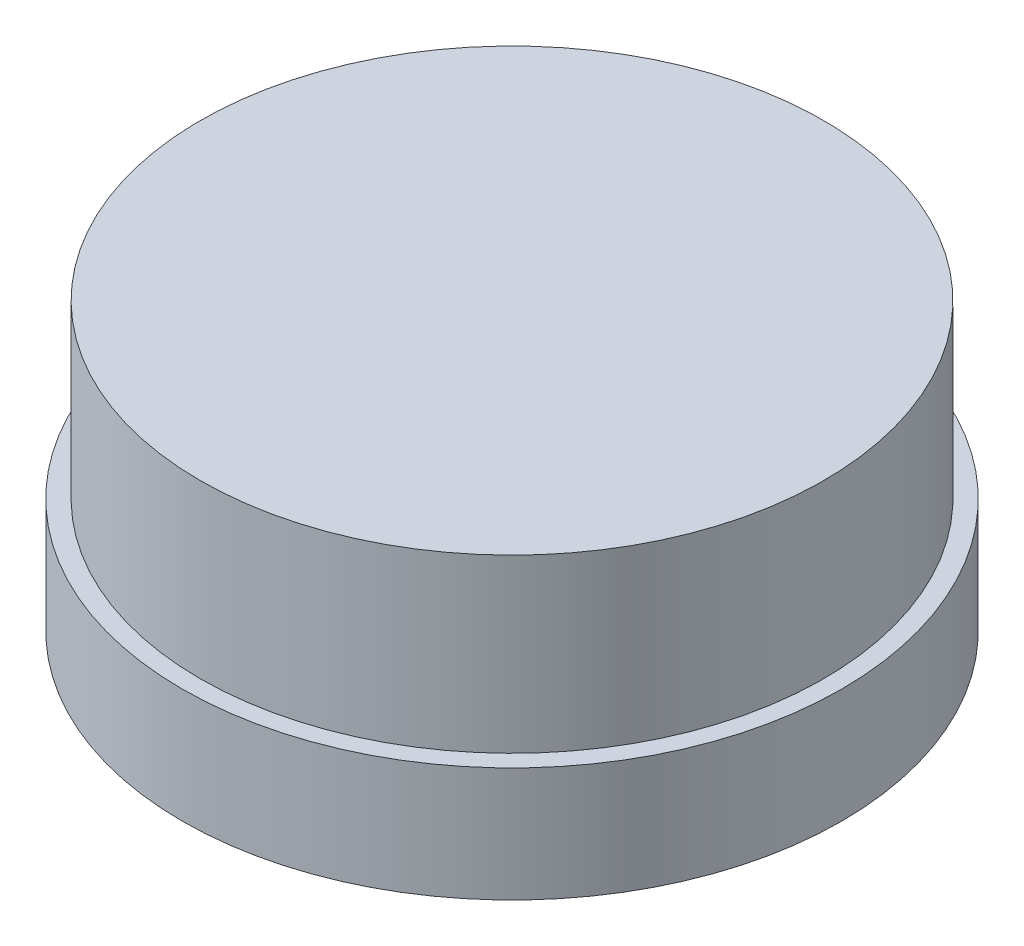
ISO-10303-21;
HEADER;
FILE_DESCRIPTION(('STEP AP214'),'2;1');
FILE_NAME('part.step','',(''),(''),'','','');
FILE_SCHEMA(('AUTOMOTIVE_DESIGN { 1 0 10303 214 1 1 1 1 }'));
ENDSEC;
DATA;
#1=APPLICATION_CONTEXT('core data for automotive mechanical design processes');
#2=APPLICATION_PROTOCOL_DEFINITION('international standard','automotive_design',2000,#1);
#3=PRODUCT_CONTEXT('',#1,'mechanical');
#4=PRODUCT('Part','Part','',(#3));
#5=PRODUCT_RELATED_PRODUCT_CATEGORY('part','',(#4));
#6=PRODUCT_DEFINITION_FORMATION('','',#4);
#7=PRODUCT_DEFINITION_CONTEXT('part definition',#1,'design');
#8=PRODUCT_DEFINITION('design','',#6,#7);
#9=PRODUCT_DEFINITION_SHAPE('','',#8);
#10=(LENGTH_UNIT() NAMED_UNIT(*) SI_UNIT(.MILLI.,.METRE.));
#11=(NAMED_UNIT(*) PLANE_ANGLE_UNIT() SI_UNIT($,.RADIAN.));
#12=(NAMED_UNIT(*) SI_UNIT($,.STERADIAN.) SOLID_ANGLE_UNIT());
#13=UNCERTAINTY_MEASURE_WITH_UNIT(LENGTH_MEASURE(1.E-05),#10,'distance_accuracy_value','');
#14=(GEOMETRIC_REPRESENTATION_CONTEXT(3) GLOBAL_UNCERTAINTY_ASSIGNED_CONTEXT((#13)) GLOBAL_UNIT_ASSIGNED_CONTEXT((#10,
#11,#12)) REPRESENTATION_CONTEXT('',''));
#15=CARTESIAN_POINT('',(0.,0.,0.));
#16=DIRECTION('',(0.,0.,1.));
#17=DIRECTION('',(1.,0.,0.));
#18=AXIS2_PLACEMENT_3D('',#15,#16,#17);
#19=CARTESIAN_POINT('',(0.,9.,0.));
#20=DIRECTION('',(0.,-1.,0.));
#21=DIRECTION('',(0.,0.,-1.));
#22=AXIS2_PLACEMENT_3D('',#19,#20,#21);
#23=CYLINDRICAL_SURFACE('',#22,16.35);
#24=CARTESIAN_POINT('',(0.,9.,0.));
#25=DIRECTION('',(0.,1.,0.));
#26=DIRECTION('',(0.,0.,1.));
#27=AXIS2_PLACEMENT_3D('',#24,#25,#26);
#28=CIRCLE('',#27,16.35);
#29=CARTESIAN_POINT('',(0.,9.,16.35));
#30=VERTEX_POINT('',#29);
#31=EDGE_CURVE('E10',#30,#30,#28,.T.);
#32=ORIENTED_EDGE('',*,*,#31,.F.);
#33=EDGE_LOOP('',(#32));
#34=FACE_BOUND('',#33,.T.);
#35=CARTESIAN_POINT('',(0.,0.,0.));
#36=DIRECTION('',(0.,1.,0.));
#37=DIRECTION('',(0.,0.,1.));
#38=AXIS2_PLACEMENT_3D('',#35,#36,#37);
#39=CIRCLE('',#38,16.35);
#40=CARTESIAN_POINT('',(0.,0.,16.35));
#41=VERTEX_POINT('',#40);
#42=EDGE_CURVE('E36',#41,#41,#39,.T.);
#43=ORIENTED_EDGE('',*,*,#42,.T.);
#44=EDGE_LOOP('',(#43));
#45=FACE_BOUND('',#44,.T.);
#46=ADVANCED_FACE('F33',(#34,#45),#23,.T.);
#47=CARTESIAN_POINT('',(0.,9.,0.));
#48=DIRECTION('',(0.,1.,0.));
#49=DIRECTION('',(0.,0.,1.));
#50=AXIS2_PLACEMENT_3D('',#47,#48,#49);
#51=PLANE('',#50);
#52=ORIENTED_EDGE('',*,*,#31,.T.);
#53=EDGE_LOOP('',(#52));
#54=FACE_BOUND('',#53,.T.);
#55=ADVANCED_FACE('F56',(#54),#51,.T.);
#56=CARTESIAN_POINT('',(0.,-6.,0.));
#57=DIRECTION('',(0.,1.,0.));
#58=DIRECTION('',(0.,0.,1.));
#59=AXIS2_PLACEMENT_3D('',#56,#57,#58);
#60=CYLINDRICAL_SURFACE('',#59,17.29);
#61=CARTESIAN_POINT('',(0.,-6.,0.));
#62=DIRECTION('',(0.,-1.,0.));
#63=DIRECTION('',(0.,0.,-1.));
#64=AXIS2_PLACEMENT_3D('',#61,#62,#63);
#65=CIRCLE('',#64,17.29);
#66=CARTESIAN_POINT('',(0.,-6.,-17.29));
#67=VERTEX_POINT('',#66);
#68=EDGE_CURVE('E43',#67,#67,#65,.T.);
#69=ORIENTED_EDGE('',*,*,#68,.F.);
#70=EDGE_LOOP('',(#69));
#71=FACE_BOUND('',#70,.T.);
#72=CARTESIAN_POINT('',(0.,0.,0.));
#73=DIRECTION('',(0.,-1.,0.));
#74=DIRECTION('',(0.,0.,-1.));
#75=AXIS2_PLACEMENT_3D('',#72,#73,#74);
#76=CIRCLE('',#75,17.29);
#77=CARTESIAN_POINT('',(0.,0.,-17.29));
#78=VERTEX_POINT('',#77);
#79=EDGE_CURVE('E45',#78,#78,#76,.T.);
#80=ORIENTED_EDGE('',*,*,#79,.T.);
#81=EDGE_LOOP('',(#80));
#82=FACE_BOUND('',#81,.T.);
#83=ADVANCED_FACE('F53',(#71,#82),#60,.T.);
#84=CARTESIAN_POINT('',(0.,-6.,0.));
#85=DIRECTION('',(0.,-1.,0.));
#86=DIRECTION('',(0.,0.,-1.));
#87=AXIS2_PLACEMENT_3D('',#84,#85,#86);
#88=PLANE('',#87);
#89=ORIENTED_EDGE('',*,*,#68,.T.);
#90=EDGE_LOOP('',(#89));
#91=FACE_BOUND('',#90,.T.);
#92=ADVANCED_FACE('F51',(#91),#88,.T.);
#93=CARTESIAN_POINT('',(0.,0.,0.));
#94=DIRECTION('',(0.,-1.,0.));
#95=DIRECTION('',(0.,0.,-1.));
#96=AXIS2_PLACEMENT_3D('',#93,#94,#95);
#97=PLANE('',#96);
#98=ORIENTED_EDGE('',*,*,#42,.F.);
#99=EDGE_LOOP('',(#98));
#100=FACE_BOUND('',#99,.T.);
#101=ORIENTED_EDGE('',*,*,#79,.F.);
#102=EDGE_LOOP('',(#101));
#103=FACE_BOUND('',#102,.T.);
#104=ADVANCED_FACE('F60',(#100,#103),#97,.F.);
#105=CLOSED_SHELL('',(#46,#55,#83,#92,#104));
#106=MANIFOLD_SOLID_BREP('B2',#105);
#107=ADVANCED_BREP_SHAPE_REPRESENTATION('',(#18,#106),#14);
#108=SHAPE_DEFINITION_REPRESENTATION(#9,#107);
ENDSEC;
END-ISO-10303-21;
